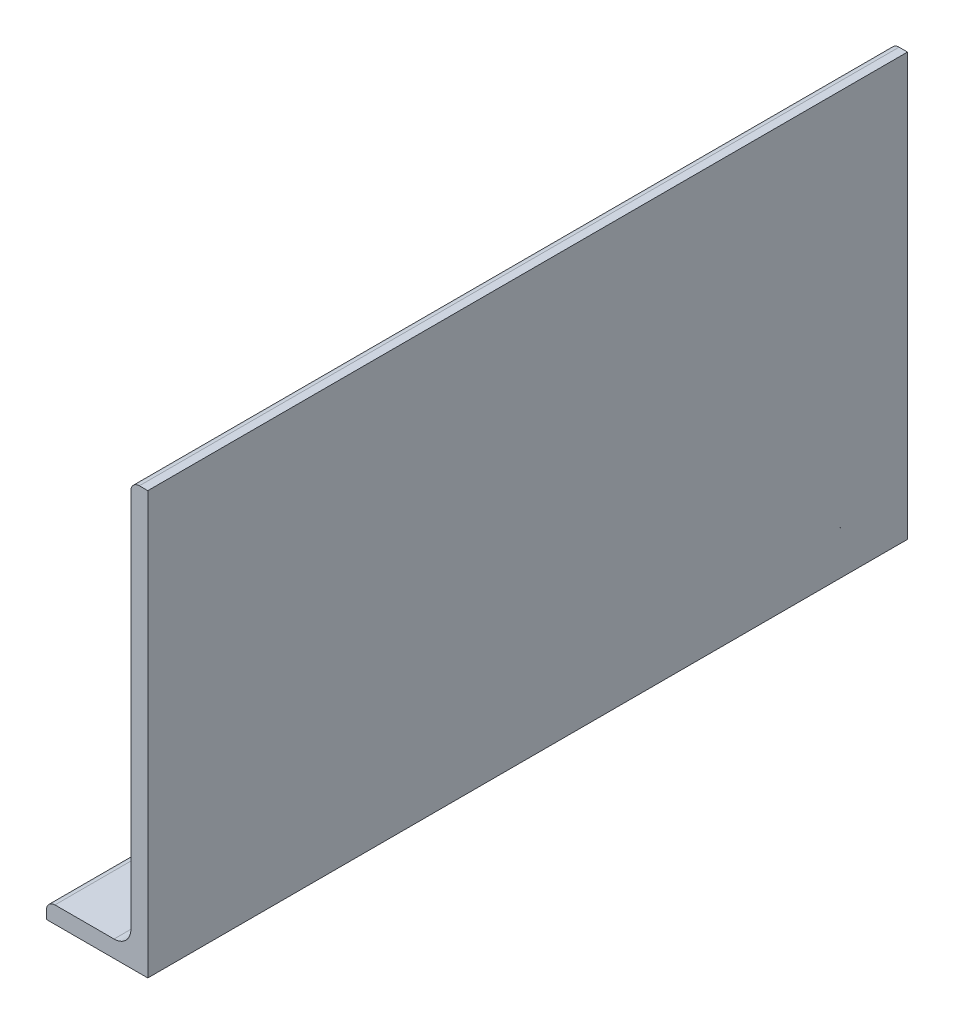
ISO-10303-21;
HEADER;
FILE_DESCRIPTION(('STEP AP214'),'2;1');
FILE_NAME('part.step','',(''),(''),'','','');
FILE_SCHEMA(('AUTOMOTIVE_DESIGN { 1 0 10303 214 1 1 1 1 }'));
ENDSEC;
DATA;
#1=APPLICATION_CONTEXT('core data for automotive mechanical design processes');
#2=APPLICATION_PROTOCOL_DEFINITION('international standard','automotive_design',2000,#1);
#3=PRODUCT_CONTEXT('',#1,'mechanical');
#4=PRODUCT('Part','Part','',(#3));
#5=PRODUCT_RELATED_PRODUCT_CATEGORY('part','',(#4));
#6=PRODUCT_DEFINITION_FORMATION('','',#4);
#7=PRODUCT_DEFINITION_CONTEXT('part definition',#1,'design');
#8=PRODUCT_DEFINITION('design','',#6,#7);
#9=PRODUCT_DEFINITION_SHAPE('','',#8);
#10=(LENGTH_UNIT() NAMED_UNIT(*) SI_UNIT(.MILLI.,.METRE.));
#11=(NAMED_UNIT(*) PLANE_ANGLE_UNIT() SI_UNIT($,.RADIAN.));
#12=(NAMED_UNIT(*) SI_UNIT($,.STERADIAN.) SOLID_ANGLE_UNIT());
#13=UNCERTAINTY_MEASURE_WITH_UNIT(LENGTH_MEASURE(1.E-05),#10,'distance_accuracy_value','');
#14=(GEOMETRIC_REPRESENTATION_CONTEXT(3) GLOBAL_UNCERTAINTY_ASSIGNED_CONTEXT((#13)) GLOBAL_UNIT_ASSIGNED_CONTEXT((#10,
#11,#12)) REPRESENTATION_CONTEXT('',''));
#15=CARTESIAN_POINT('',(0.,0.,0.));
#16=DIRECTION('',(0.,0.,1.));
#17=DIRECTION('',(1.,0.,0.));
#18=AXIS2_PLACEMENT_3D('',#15,#16,#17);
#19=CARTESIAN_POINT('',(1262.50750682687,-206.048661528243,90.));
#20=DIRECTION('',(0.,-1.,0.));
#21=DIRECTION('',(0.,0.,-1.));
#22=AXIS2_PLACEMENT_3D('',#19,#20,#21);
#23=PLANE('',#22);
#24=DIRECTION('',(-1.,0.,0.));
#25=VECTOR('',#24,1.);
#26=CARTESIAN_POINT('',(1262.50750682687,-206.048661528243,0.));
#27=LINE('',#26,#25);
#28=CARTESIAN_POINT('',(1262.50750682687,-206.048661528243,0.));
#29=VERTEX_POINT('',#28);
#30=CARTESIAN_POINT('',(1261.50750682687,-206.048661528243,0.));
#31=VERTEX_POINT('',#30);
#32=EDGE_CURVE('E137',#29,#31,#27,.T.);
#33=ORIENTED_EDGE('',*,*,#32,.T.);
#34=DIRECTION('',(0.,0.,-1.));
#35=VECTOR('',#34,1.);
#36=CARTESIAN_POINT('',(1261.50750682687,-206.048661528243,90.));
#37=LINE('',#36,#35);
#38=CARTESIAN_POINT('',(1261.50750682687,-206.048661528243,90.));
#39=VERTEX_POINT('',#38);
#40=EDGE_CURVE('E168',#31,#39,#37,.F.);
#41=ORIENTED_EDGE('',*,*,#40,.T.);
#42=DIRECTION('',(-1.,0.,0.));
#43=VECTOR('',#42,1.);
#44=CARTESIAN_POINT('',(1262.50750682687,-206.048661528243,90.));
#45=LINE('',#44,#43);
#46=CARTESIAN_POINT('',(1262.50750682687,-206.048661528243,90.));
#47=VERTEX_POINT('',#46);
#48=EDGE_CURVE('E149',#47,#39,#45,.T.);
#49=ORIENTED_EDGE('',*,*,#48,.F.);
#50=DIRECTION('',(0.,0.,-1.));
#51=VECTOR('',#50,1.);
#52=CARTESIAN_POINT('',(1262.50750682687,-206.048661528243,90.));
#53=LINE('',#52,#51);
#54=EDGE_CURVE('E133',#47,#29,#53,.T.);
#55=ORIENTED_EDGE('',*,*,#54,.T.);
#56=EDGE_LOOP('',(#33,#41,#49,#55));
#57=FACE_BOUND('',#56,.T.);
#58=ADVANCED_FACE('F33',(#57),#23,.F.);
#59=CARTESIAN_POINT('',(1260.50750682687,-254.048661528243,90.));
#60=DIRECTION('',(1.,0.,0.));
#61=DIRECTION('',(0.,0.,-1.));
#62=AXIS2_PLACEMENT_3D('',#59,#60,#61);
#63=PLANE('',#62);
#64=DIRECTION('',(0.,-1.,0.));
#65=VECTOR('',#64,1.);
#66=CARTESIAN_POINT('',(1260.50750682687,-254.048661528243,0.));
#67=LINE('',#66,#65);
#68=CARTESIAN_POINT('',(1260.50750682687,-207.048661528243,0.));
#69=VERTEX_POINT('',#68);
#70=CARTESIAN_POINT('',(1260.50750682687,-252.048661528243,0.));
#71=VERTEX_POINT('',#70);
#72=EDGE_CURVE('E140',#69,#71,#67,.T.);
#73=ORIENTED_EDGE('',*,*,#72,.T.);
#74=DIRECTION('',(0.,0.,-1.));
#75=VECTOR('',#74,1.);
#76=CARTESIAN_POINT('',(1260.50750682687,-252.048661528243,90.));
#77=LINE('',#76,#75);
#78=CARTESIAN_POINT('',(1260.50750682687,-252.048661528243,90.));
#79=VERTEX_POINT('',#78);
#80=EDGE_CURVE('E56',#71,#79,#77,.F.);
#81=ORIENTED_EDGE('',*,*,#80,.T.);
#82=DIRECTION('',(0.,-1.,0.));
#83=VECTOR('',#82,1.);
#84=CARTESIAN_POINT('',(1260.50750682687,-254.048661528243,90.));
#85=LINE('',#84,#83);
#86=CARTESIAN_POINT('',(1260.50750682687,-207.048661528243,90.));
#87=VERTEX_POINT('',#86);
#88=EDGE_CURVE('E190',#87,#79,#85,.T.);
#89=ORIENTED_EDGE('',*,*,#88,.F.);
#90=DIRECTION('',(0.,0.,-1.));
#91=VECTOR('',#90,1.);
#92=CARTESIAN_POINT('',(1260.50750682687,-207.048661528243,90.));
#93=LINE('',#92,#91);
#94=EDGE_CURVE('E165',#87,#69,#93,.T.);
#95=ORIENTED_EDGE('',*,*,#94,.T.);
#96=EDGE_LOOP('',(#73,#81,#89,#95));
#97=FACE_BOUND('',#96,.T.);
#98=ADVANCED_FACE('F212',(#97),#63,.F.);
#99=CARTESIAN_POINT('',(1250.50750682687,-254.048661528243,90.));
#100=DIRECTION('',(0.,-1.,0.));
#101=DIRECTION('',(0.,0.,-1.));
#102=AXIS2_PLACEMENT_3D('',#99,#100,#101);
#103=PLANE('',#102);
#104=CARTESIAN_POINT('',(1255.00750682687,-254.048661528243,70.));
#105=DIRECTION('',(0.,1.,0.));
#106=DIRECTION('',(0.,0.,1.));
#107=AXIS2_PLACEMENT_3D('',#104,#105,#106);
#108=CIRCLE('',#107,1.60000000000013);
#109=CARTESIAN_POINT('',(1255.00750682687,-254.048661528243,71.6000000000001));
#110=VERTEX_POINT('',#109);
#111=EDGE_CURVE('E176',#110,#110,#108,.T.);
#112=ORIENTED_EDGE('',*,*,#111,.F.);
#113=EDGE_LOOP('',(#112));
#114=FACE_BOUND('',#113,.T.);
#115=CARTESIAN_POINT('',(1255.00750682687,-254.048661528243,20.));
#116=DIRECTION('',(0.,1.,0.));
#117=DIRECTION('',(0.,0.,1.));
#118=AXIS2_PLACEMENT_3D('',#115,#116,#117);
#119=CIRCLE('',#118,1.60000000000013);
#120=CARTESIAN_POINT('',(1255.00750682687,-254.048661528243,21.6000000000001));
#121=VERTEX_POINT('',#120);
#122=EDGE_CURVE('E181',#121,#121,#119,.T.);
#123=ORIENTED_EDGE('',*,*,#122,.F.);
#124=EDGE_LOOP('',(#123));
#125=FACE_BOUND('',#124,.T.);
#126=DIRECTION('',(-1.,0.,0.));
#127=VECTOR('',#126,1.);
#128=CARTESIAN_POINT('',(1250.50750682687,-254.048661528243,90.));
#129=LINE('',#128,#127);
#130=CARTESIAN_POINT('',(1258.50750682687,-254.048661528243,90.));
#131=VERTEX_POINT('',#130);
#132=CARTESIAN_POINT('',(1251.50750682687,-254.048661528243,90.));
#133=VERTEX_POINT('',#132);
#134=EDGE_CURVE('E116',#131,#133,#129,.T.);
#135=ORIENTED_EDGE('',*,*,#134,.F.);
#136=DIRECTION('',(0.,0.,-1.));
#137=VECTOR('',#136,1.);
#138=CARTESIAN_POINT('',(1258.50750682687,-254.048661528243,0.));
#139=LINE('',#138,#137);
#140=CARTESIAN_POINT('',(1258.50750682687,-254.048661528243,0.));
#141=VERTEX_POINT('',#140);
#142=EDGE_CURVE('E170',#131,#141,#139,.T.);
#143=ORIENTED_EDGE('',*,*,#142,.T.);
#144=DIRECTION('',(-1.,0.,0.));
#145=VECTOR('',#144,1.);
#146=CARTESIAN_POINT('',(1250.50750682687,-254.048661528243,0.));
#147=LINE('',#146,#145);
#148=CARTESIAN_POINT('',(1251.50750682687,-254.048661528243,0.));
#149=VERTEX_POINT('',#148);
#150=EDGE_CURVE('E142',#141,#149,#147,.T.);
#151=ORIENTED_EDGE('',*,*,#150,.T.);
#152=DIRECTION('',(0.,0.,-1.));
#153=VECTOR('',#152,1.);
#154=CARTESIAN_POINT('',(1251.50750682687,-254.048661528243,90.));
#155=LINE('',#154,#153);
#156=EDGE_CURVE('E159',#149,#133,#155,.F.);
#157=ORIENTED_EDGE('',*,*,#156,.T.);
#158=EDGE_LOOP('',(#135,#143,#151,#157));
#159=FACE_BOUND('',#158,.T.);
#160=ADVANCED_FACE('F196',(#114,#125,#159),#103,.F.);
#161=CARTESIAN_POINT('',(1250.50750682687,-256.048661528243,90.));
#162=DIRECTION('',(1.,0.,0.));
#163=DIRECTION('',(0.,0.,-1.));
#164=AXIS2_PLACEMENT_3D('',#161,#162,#163);
#165=PLANE('',#164);
#166=DIRECTION('',(0.,-1.,0.));
#167=VECTOR('',#166,1.);
#168=CARTESIAN_POINT('',(1250.50750682687,-256.048661528243,90.));
#169=LINE('',#168,#167);
#170=CARTESIAN_POINT('',(1250.50750682687,-255.048661528243,90.));
#171=VERTEX_POINT('',#170);
#172=CARTESIAN_POINT('',(1250.50750682687,-256.048661528243,90.));
#173=VERTEX_POINT('',#172);
#174=EDGE_CURVE('E105',#171,#173,#169,.T.);
#175=ORIENTED_EDGE('',*,*,#174,.F.);
#176=DIRECTION('',(0.,0.,-1.));
#177=VECTOR('',#176,1.);
#178=CARTESIAN_POINT('',(1250.50750682687,-255.048661528243,90.));
#179=LINE('',#178,#177);
#180=CARTESIAN_POINT('',(1250.50750682687,-255.048661528243,0.));
#181=VERTEX_POINT('',#180);
#182=EDGE_CURVE('E125',#171,#181,#179,.T.);
#183=ORIENTED_EDGE('',*,*,#182,.T.);
#184=DIRECTION('',(0.,-1.,0.));
#185=VECTOR('',#184,1.);
#186=CARTESIAN_POINT('',(1250.50750682687,-256.048661528243,0.));
#187=LINE('',#186,#185);
#188=CARTESIAN_POINT('',(1250.50750682687,-256.048661528243,0.));
#189=VERTEX_POINT('',#188);
#190=EDGE_CURVE('E122',#181,#189,#187,.T.);
#191=ORIENTED_EDGE('',*,*,#190,.T.);
#192=DIRECTION('',(0.,0.,-1.));
#193=VECTOR('',#192,1.);
#194=CARTESIAN_POINT('',(1250.50750682687,-256.048661528243,90.));
#195=LINE('',#194,#193);
#196=EDGE_CURVE('E119',#173,#189,#195,.T.);
#197=ORIENTED_EDGE('',*,*,#196,.F.);
#198=EDGE_LOOP('',(#175,#183,#191,#197));
#199=FACE_BOUND('',#198,.T.);
#200=ADVANCED_FACE('F120',(#199),#165,.F.);
#201=CARTESIAN_POINT('',(1262.50750682687,-256.048661528243,90.));
#202=DIRECTION('',(0.,1.,0.));
#203=DIRECTION('',(0.,0.,1.));
#204=AXIS2_PLACEMENT_3D('',#201,#202,#203);
#205=PLANE('',#204);
#206=CARTESIAN_POINT('',(1255.00750682687,-256.048661528243,70.));
#207=DIRECTION('',(0.,1.,0.));
#208=DIRECTION('',(0.,0.,1.));
#209=AXIS2_PLACEMENT_3D('',#206,#207,#208);
#210=CIRCLE('',#209,1.60000000000013);
#211=CARTESIAN_POINT('',(1255.00750682687,-256.048661528243,71.6000000000001));
#212=VERTEX_POINT('',#211);
#213=EDGE_CURVE('E37',#212,#212,#210,.T.);
#214=ORIENTED_EDGE('',*,*,#213,.T.);
#215=EDGE_LOOP('',(#214));
#216=FACE_BOUND('',#215,.T.);
#217=CARTESIAN_POINT('',(1255.00750682687,-256.048661528243,20.));
#218=DIRECTION('',(0.,1.,0.));
#219=DIRECTION('',(0.,0.,1.));
#220=AXIS2_PLACEMENT_3D('',#217,#218,#219);
#221=CIRCLE('',#220,1.60000000000013);
#222=CARTESIAN_POINT('',(1255.00750682687,-256.048661528243,21.6000000000001));
#223=VERTEX_POINT('',#222);
#224=EDGE_CURVE('E174',#223,#223,#221,.T.);
#225=ORIENTED_EDGE('',*,*,#224,.T.);
#226=EDGE_LOOP('',(#225));
#227=FACE_BOUND('',#226,.T.);
#228=DIRECTION('',(1.,0.,0.));
#229=VECTOR('',#228,1.);
#230=CARTESIAN_POINT('',(1262.50750682687,-256.048661528243,0.));
#231=LINE('',#230,#229);
#232=CARTESIAN_POINT('',(1262.50750682687,-256.048661528243,0.));
#233=VERTEX_POINT('',#232);
#234=EDGE_CURVE('E145',#189,#233,#231,.T.);
#235=ORIENTED_EDGE('',*,*,#234,.T.);
#236=DIRECTION('',(0.,0.,-1.));
#237=VECTOR('',#236,1.);
#238=CARTESIAN_POINT('',(1262.50750682687,-256.048661528243,90.));
#239=LINE('',#238,#237);
#240=CARTESIAN_POINT('',(1262.50750682687,-256.048661528243,90.));
#241=VERTEX_POINT('',#240);
#242=EDGE_CURVE('E126',#241,#233,#239,.T.);
#243=ORIENTED_EDGE('',*,*,#242,.F.);
#244=DIRECTION('',(1.,0.,0.));
#245=VECTOR('',#244,1.);
#246=CARTESIAN_POINT('',(1262.50750682687,-256.048661528243,90.));
#247=LINE('',#246,#245);
#248=EDGE_CURVE('E109',#173,#241,#247,.T.);
#249=ORIENTED_EDGE('',*,*,#248,.F.);
#250=ORIENTED_EDGE('',*,*,#196,.T.);
#251=EDGE_LOOP('',(#235,#243,#249,#250));
#252=FACE_BOUND('',#251,.T.);
#253=ADVANCED_FACE('F128',(#216,#227,#252),#205,.F.);
#254=CARTESIAN_POINT('',(1262.50750682687,-206.048661528243,90.));
#255=DIRECTION('',(-1.,0.,0.));
#256=DIRECTION('',(0.,0.,1.));
#257=AXIS2_PLACEMENT_3D('',#254,#255,#256);
#258=PLANE('',#257);
#259=DIRECTION('',(0.,1.,0.));
#260=VECTOR('',#259,1.);
#261=CARTESIAN_POINT('',(1262.50750682687,-206.048661528243,0.));
#262=LINE('',#261,#260);
#263=EDGE_CURVE('E147',#233,#29,#262,.T.);
#264=ORIENTED_EDGE('',*,*,#263,.T.);
#265=ORIENTED_EDGE('',*,*,#54,.F.);
#266=DIRECTION('',(0.,1.,0.));
#267=VECTOR('',#266,1.);
#268=CARTESIAN_POINT('',(1262.50750682687,-206.048661528243,90.));
#269=LINE('',#268,#267);
#270=EDGE_CURVE('E131',#241,#47,#269,.T.);
#271=ORIENTED_EDGE('',*,*,#270,.F.);
#272=ORIENTED_EDGE('',*,*,#242,.T.);
#273=EDGE_LOOP('',(#264,#265,#271,#272));
#274=FACE_BOUND('',#273,.T.);
#275=ADVANCED_FACE('F203',(#274),#258,.F.);
#276=CARTESIAN_POINT('',(0.,0.,90.));
#277=DIRECTION('',(0.,0.,-1.));
#278=DIRECTION('',(-1.,0.,0.));
#279=AXIS2_PLACEMENT_3D('',#276,#277,#278);
#280=PLANE('',#279);
#281=ORIENTED_EDGE('',*,*,#88,.T.);
#282=CARTESIAN_POINT('',(1258.50750682687,-252.048661528243,90.));
#283=DIRECTION('',(0.,0.,-1.));
#284=DIRECTION('',(-1.,0.,0.));
#285=AXIS2_PLACEMENT_3D('',#282,#283,#284);
#286=CIRCLE('',#285,2.);
#287=EDGE_CURVE('E11',#79,#131,#286,.T.);
#288=ORIENTED_EDGE('',*,*,#287,.T.);
#289=ORIENTED_EDGE('',*,*,#134,.T.);
#290=CARTESIAN_POINT('',(1251.50750682687,-255.048661528243,90.));
#291=DIRECTION('',(0.,0.,-1.));
#292=DIRECTION('',(-1.,0.,0.));
#293=AXIS2_PLACEMENT_3D('',#290,#291,#292);
#294=CIRCLE('',#293,1.);
#295=EDGE_CURVE('E112',#133,#171,#294,.F.);
#296=ORIENTED_EDGE('',*,*,#295,.T.);
#297=ORIENTED_EDGE('',*,*,#174,.T.);
#298=ORIENTED_EDGE('',*,*,#248,.T.);
#299=ORIENTED_EDGE('',*,*,#270,.T.);
#300=ORIENTED_EDGE('',*,*,#48,.T.);
#301=CARTESIAN_POINT('',(1261.50750682687,-207.048661528243,90.));
#302=DIRECTION('',(0.,0.,-1.));
#303=DIRECTION('',(-1.,0.,0.));
#304=AXIS2_PLACEMENT_3D('',#301,#302,#303);
#305=CIRCLE('',#304,1.);
#306=EDGE_CURVE('E162',#39,#87,#305,.F.);
#307=ORIENTED_EDGE('',*,*,#306,.T.);
#308=EDGE_LOOP('',(#281,#288,#289,#296,#297,#298,#299,#300,#307));
#309=FACE_BOUND('',#308,.T.);
#310=ADVANCED_FACE('F107',(#309),#280,.F.);
#311=CARTESIAN_POINT('',(0.,0.,0.));
#312=DIRECTION('',(0.,0.,-1.));
#313=DIRECTION('',(-1.,0.,0.));
#314=AXIS2_PLACEMENT_3D('',#311,#312,#313);
#315=PLANE('',#314);
#316=ORIENTED_EDGE('',*,*,#190,.F.);
#317=CARTESIAN_POINT('',(1251.50750682687,-255.048661528243,0.));
#318=DIRECTION('',(0.,0.,-1.));
#319=DIRECTION('',(-1.,0.,0.));
#320=AXIS2_PLACEMENT_3D('',#317,#318,#319);
#321=CIRCLE('',#320,1.);
#322=EDGE_CURVE('E156',#181,#149,#321,.T.);
#323=ORIENTED_EDGE('',*,*,#322,.T.);
#324=ORIENTED_EDGE('',*,*,#150,.F.);
#325=CARTESIAN_POINT('',(1258.50750682687,-252.048661528243,0.));
#326=DIRECTION('',(0.,0.,-1.));
#327=DIRECTION('',(-1.,0.,0.));
#328=AXIS2_PLACEMENT_3D('',#325,#326,#327);
#329=CIRCLE('',#328,2.);
#330=EDGE_CURVE('E42',#141,#71,#329,.F.);
#331=ORIENTED_EDGE('',*,*,#330,.T.);
#332=ORIENTED_EDGE('',*,*,#72,.F.);
#333=CARTESIAN_POINT('',(1261.50750682687,-207.048661528243,0.));
#334=DIRECTION('',(0.,0.,-1.));
#335=DIRECTION('',(-1.,0.,0.));
#336=AXIS2_PLACEMENT_3D('',#333,#334,#335);
#337=CIRCLE('',#336,1.);
#338=EDGE_CURVE('E154',#69,#31,#337,.T.);
#339=ORIENTED_EDGE('',*,*,#338,.T.);
#340=ORIENTED_EDGE('',*,*,#32,.F.);
#341=ORIENTED_EDGE('',*,*,#263,.F.);
#342=ORIENTED_EDGE('',*,*,#234,.F.);
#343=EDGE_LOOP('',(#316,#323,#324,#331,#332,#339,#340,#341,#342));
#344=FACE_BOUND('',#343,.T.);
#345=ADVANCED_FACE('F199',(#344),#315,.T.);
#346=CARTESIAN_POINT('',(1251.50750682687,-255.048661528243,90.));
#347=DIRECTION('',(0.,0.,-1.));
#348=DIRECTION('',(-1.,0.,0.));
#349=AXIS2_PLACEMENT_3D('',#346,#347,#348);
#350=CYLINDRICAL_SURFACE('',#349,1.);
#351=ORIENTED_EDGE('',*,*,#295,.F.);
#352=ORIENTED_EDGE('',*,*,#156,.F.);
#353=ORIENTED_EDGE('',*,*,#322,.F.);
#354=ORIENTED_EDGE('',*,*,#182,.F.);
#355=EDGE_LOOP('',(#351,#352,#353,#354));
#356=FACE_BOUND('',#355,.T.);
#357=ADVANCED_FACE('F198',(#356),#350,.T.);
#358=CARTESIAN_POINT('',(1261.50750682687,-207.048661528243,90.));
#359=DIRECTION('',(0.,0.,-1.));
#360=DIRECTION('',(-1.,0.,0.));
#361=AXIS2_PLACEMENT_3D('',#358,#359,#360);
#362=CYLINDRICAL_SURFACE('',#361,1.);
#363=ORIENTED_EDGE('',*,*,#306,.F.);
#364=ORIENTED_EDGE('',*,*,#40,.F.);
#365=ORIENTED_EDGE('',*,*,#338,.F.);
#366=ORIENTED_EDGE('',*,*,#94,.F.);
#367=EDGE_LOOP('',(#363,#364,#365,#366));
#368=FACE_BOUND('',#367,.T.);
#369=ADVANCED_FACE('F211',(#368),#362,.T.);
#370=CARTESIAN_POINT('',(1258.50750682687,-252.048661528243,90.));
#371=DIRECTION('',(0.,0.,1.));
#372=DIRECTION('',(1.,0.,0.));
#373=AXIS2_PLACEMENT_3D('',#370,#371,#372);
#374=CYLINDRICAL_SURFACE('',#373,2.);
#375=ORIENTED_EDGE('',*,*,#287,.F.);
#376=ORIENTED_EDGE('',*,*,#80,.F.);
#377=ORIENTED_EDGE('',*,*,#330,.F.);
#378=ORIENTED_EDGE('',*,*,#142,.F.);
#379=EDGE_LOOP('',(#375,#376,#377,#378));
#380=FACE_BOUND('',#379,.T.);
#381=ADVANCED_FACE('F35',(#380),#374,.F.);
#382=CARTESIAN_POINT('',(1255.00750682687,-264.048661528243,20.));
#383=DIRECTION('',(0.,1.,0.));
#384=DIRECTION('',(0.,0.,1.));
#385=AXIS2_PLACEMENT_3D('',#382,#383,#384);
#386=CYLINDRICAL_SURFACE('',#385,1.60000000000013);
#387=ORIENTED_EDGE('',*,*,#122,.T.);
#388=EDGE_LOOP('',(#387));
#389=FACE_BOUND('',#388,.T.);
#390=ORIENTED_EDGE('',*,*,#224,.F.);
#391=EDGE_LOOP('',(#390));
#392=FACE_BOUND('',#391,.T.);
#393=ADVANCED_FACE('F226',(#389,#392),#386,.F.);
#394=CARTESIAN_POINT('',(1255.00750682687,-264.048661528243,70.));
#395=DIRECTION('',(0.,1.,0.));
#396=DIRECTION('',(0.,0.,1.));
#397=AXIS2_PLACEMENT_3D('',#394,#395,#396);
#398=CYLINDRICAL_SURFACE('',#397,1.60000000000013);
#399=ORIENTED_EDGE('',*,*,#111,.T.);
#400=EDGE_LOOP('',(#399));
#401=FACE_BOUND('',#400,.T.);
#402=ORIENTED_EDGE('',*,*,#213,.F.);
#403=EDGE_LOOP('',(#402));
#404=FACE_BOUND('',#403,.T.);
#405=ADVANCED_FACE('F231',(#401,#404),#398,.F.);
#406=CLOSED_SHELL('',(#58,#98,#160,#200,#253,#275,#310,#345,#357,#369,#381,#393,#405));
#407=MANIFOLD_SOLID_BREP('B2',#406);
#408=ADVANCED_BREP_SHAPE_REPRESENTATION('',(#18,#407),#14);
#409=SHAPE_DEFINITION_REPRESENTATION(#9,#408);
ENDSEC;
END-ISO-10303-21;
